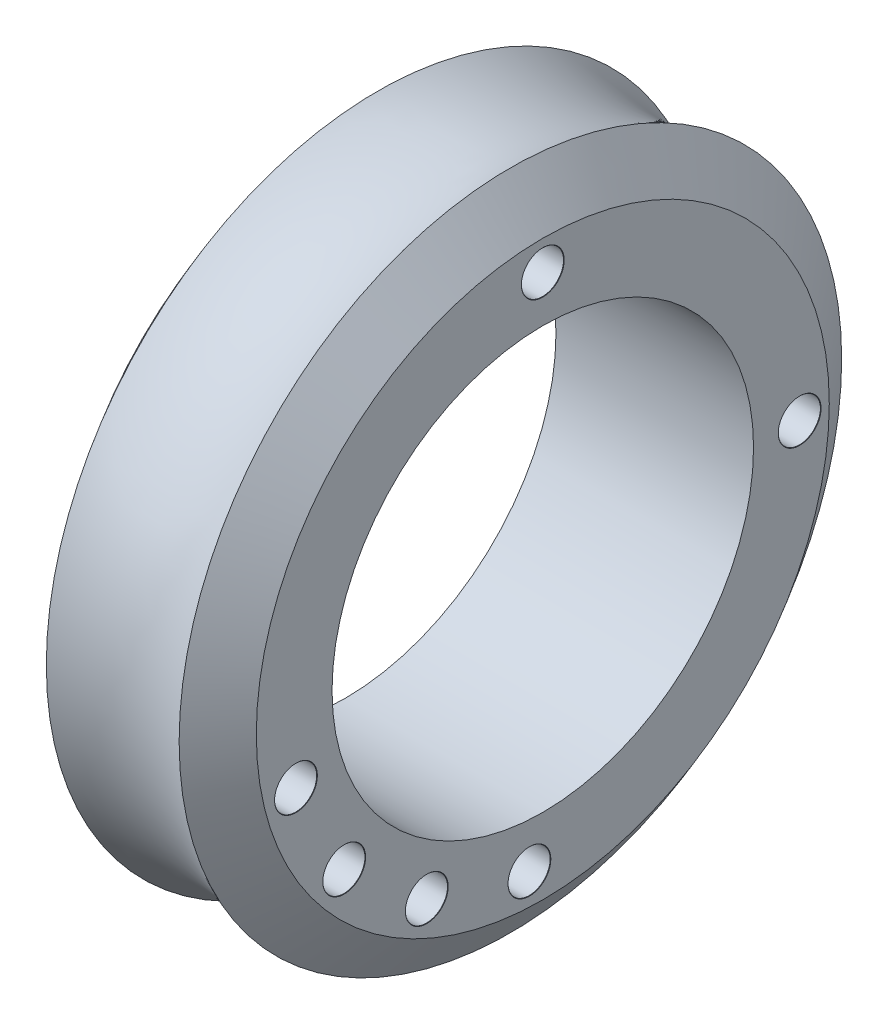
ISO-10303-21;
HEADER;
FILE_DESCRIPTION(('STEP AP214'),'2;1');
FILE_NAME('part.step','',(''),(''),'','','');
FILE_SCHEMA(('AUTOMOTIVE_DESIGN { 1 0 10303 214 1 1 1 1 }'));
ENDSEC;
DATA;
#1=APPLICATION_CONTEXT('core data for automotive mechanical design processes');
#2=APPLICATION_PROTOCOL_DEFINITION('international standard','automotive_design',2000,#1);
#3=PRODUCT_CONTEXT('',#1,'mechanical');
#4=PRODUCT('Part','Part','',(#3));
#5=PRODUCT_RELATED_PRODUCT_CATEGORY('part','',(#4));
#6=PRODUCT_DEFINITION_FORMATION('','',#4);
#7=PRODUCT_DEFINITION_CONTEXT('part definition',#1,'design');
#8=PRODUCT_DEFINITION('design','',#6,#7);
#9=PRODUCT_DEFINITION_SHAPE('','',#8);
#10=(LENGTH_UNIT() NAMED_UNIT(*) SI_UNIT(.MILLI.,.METRE.));
#11=(NAMED_UNIT(*) PLANE_ANGLE_UNIT() SI_UNIT($,.RADIAN.));
#12=(NAMED_UNIT(*) SI_UNIT($,.STERADIAN.) SOLID_ANGLE_UNIT());
#13=UNCERTAINTY_MEASURE_WITH_UNIT(LENGTH_MEASURE(1.E-05),#10,'distance_accuracy_value','');
#14=(GEOMETRIC_REPRESENTATION_CONTEXT(3) GLOBAL_UNCERTAINTY_ASSIGNED_CONTEXT((#13)) GLOBAL_UNIT_ASSIGNED_CONTEXT((#10,
#11,#12)) REPRESENTATION_CONTEXT('',''));
#15=CARTESIAN_POINT('',(0.,0.,0.));
#16=DIRECTION('',(0.,0.,1.));
#17=DIRECTION('',(1.,0.,0.));
#18=AXIS2_PLACEMENT_3D('',#15,#16,#17);
#19=CARTESIAN_POINT('',(0.,0.,0.));
#20=DIRECTION('',(1.,0.,0.));
#21=DIRECTION('',(0.,0.,-1.));
#22=AXIS2_PLACEMENT_3D('',#19,#20,#21);
#23=PLANE('',#22);
#24=CARTESIAN_POINT('',(0.,19.5000000000025,-4.69699592558647E-12));
#25=DIRECTION('',(1.,0.,0.));
#26=DIRECTION('',(0.,0.,-1.));
#27=AXIS2_PLACEMENT_3D('',#24,#25,#26);
#28=CIRCLE('',#27,1.6);
#29=CARTESIAN_POINT('',(0.,19.5000000000025,-1.60000000000469));
#30=VERTEX_POINT('',#29);
#31=EDGE_CURVE('E126',#30,#30,#28,.T.);
#32=ORIENTED_EDGE('',*,*,#31,.T.);
#33=EDGE_LOOP('',(#32));
#34=FACE_BOUND('',#33,.T.);
#35=CARTESIAN_POINT('',(0.,2.60478862967211E-12,-19.5000000000048));
#36=DIRECTION('',(1.,0.,0.));
#37=DIRECTION('',(0.,0.,-1.));
#38=AXIS2_PLACEMENT_3D('',#35,#36,#37);
#39=CIRCLE('',#38,1.6);
#40=CARTESIAN_POINT('',(0.,2.60478862967211E-12,-21.1000000000048));
#41=VERTEX_POINT('',#40);
#42=EDGE_CURVE('E117',#41,#41,#39,.T.);
#43=ORIENTED_EDGE('',*,*,#42,.T.);
#44=EDGE_LOOP('',(#43));
#45=FACE_BOUND('',#44,.T.);
#46=CARTESIAN_POINT('',(0.,-19.3734129742363,1.01531755110808));
#47=DIRECTION('',(1.,0.,0.));
#48=DIRECTION('',(0.,0.,-1.));
#49=AXIS2_PLACEMENT_3D('',#46,#47,#48);
#50=CIRCLE('',#49,1.6);
#51=CARTESIAN_POINT('',(0.,-19.3734129742363,-0.584682448891921));
#52=VERTEX_POINT('',#51);
#53=EDGE_CURVE('E106',#52,#52,#50,.T.);
#54=ORIENTED_EDGE('',*,*,#53,.T.);
#55=EDGE_LOOP('',(#54));
#56=FACE_BOUND('',#55,.T.);
#57=CARTESIAN_POINT('',(0.,-17.2855265692519,8.80741569494221));
#58=DIRECTION('',(1.,0.,0.));
#59=DIRECTION('',(0.,0.,-1.));
#60=AXIS2_PLACEMENT_3D('',#57,#58,#59);
#61=CIRCLE('',#60,1.6);
#62=CARTESIAN_POINT('',(0.,-17.2855265692519,7.20741569494221));
#63=VERTEX_POINT('',#62);
#64=EDGE_CURVE('E96',#63,#63,#61,.T.);
#65=ORIENTED_EDGE('',*,*,#64,.T.);
#66=EDGE_LOOP('',(#65));
#67=FACE_BOUND('',#66,.T.);
#68=CARTESIAN_POINT('',(0.,-5.02108947498657,18.738961030003));
#69=DIRECTION('',(1.,0.,0.));
#70=DIRECTION('',(0.,0.,-1.));
#71=AXIS2_PLACEMENT_3D('',#68,#69,#70);
#72=CIRCLE('',#71,1.6);
#73=CARTESIAN_POINT('',(0.,-5.02108947498657,17.138961030003));
#74=VERTEX_POINT('',#73);
#75=EDGE_CURVE('E86',#74,#74,#72,.T.);
#76=ORIENTED_EDGE('',*,*,#75,.T.);
#77=EDGE_LOOP('',(#76));
#78=FACE_BOUND('',#77,.T.);
#79=CARTESIAN_POINT('',(0.,-12.2088155863645,15.0766316522603));
#80=DIRECTION('',(1.,0.,0.));
#81=DIRECTION('',(0.,0.,-1.));
#82=AXIS2_PLACEMENT_3D('',#79,#80,#81);
#83=CIRCLE('',#82,1.6);
#84=CARTESIAN_POINT('',(0.,-12.2088155863645,13.4766316522603));
#85=VERTEX_POINT('',#84);
#86=EDGE_CURVE('E77',#85,#85,#83,.T.);
#87=ORIENTED_EDGE('',*,*,#86,.T.);
#88=EDGE_LOOP('',(#87));
#89=FACE_BOUND('',#88,.T.);
#90=CARTESIAN_POINT('',(0.,0.,0.));
#91=DIRECTION('',(1.,0.,0.));
#92=DIRECTION('',(0.,0.,-1.));
#93=AXIS2_PLACEMENT_3D('',#90,#91,#92);
#94=CIRCLE('',#93,16.);
#95=CARTESIAN_POINT('',(0.,0.,-16.));
#96=VERTEX_POINT('',#95);
#97=EDGE_CURVE('E73',#96,#96,#94,.T.);
#98=ORIENTED_EDGE('',*,*,#97,.T.);
#99=EDGE_LOOP('',(#98));
#100=FACE_BOUND('',#99,.T.);
#101=CARTESIAN_POINT('',(0.,0.,0.));
#102=DIRECTION('',(1.,0.,0.));
#103=DIRECTION('',(0.,0.,-1.));
#104=AXIS2_PLACEMENT_3D('',#101,#102,#103);
#105=CIRCLE('',#104,21.75);
#106=CARTESIAN_POINT('',(0.,0.,-21.75));
#107=VERTEX_POINT('',#106);
#108=EDGE_CURVE('E69',#107,#107,#105,.T.);
#109=ORIENTED_EDGE('',*,*,#108,.F.);
#110=EDGE_LOOP('',(#109));
#111=FACE_BOUND('',#110,.T.);
#112=ADVANCED_FACE('F47',(#34,#45,#56,#67,#78,#89,#100,#111),#23,.F.);
#113=CARTESIAN_POINT('',(0.,0.,0.));
#114=DIRECTION('',(1.,0.,0.));
#115=DIRECTION('',(0.,0.,-1.));
#116=AXIS2_PLACEMENT_3D('',#113,#114,#115);
#117=CONICAL_SURFACE('',#116,21.75,0.944709387251075);
#118=CARTESIAN_POINT('',(2.458670810193,0.,0.));
#119=DIRECTION('',(1.,0.,0.));
#120=DIRECTION('',(0.,0.,-1.));
#121=AXIS2_PLACEMENT_3D('',#118,#119,#120);
#122=CIRCLE('',#121,25.15);
#123=CARTESIAN_POINT('',(2.458670810193,0.,-25.15));
#124=VERTEX_POINT('',#123);
#125=EDGE_CURVE('E63',#124,#124,#122,.T.);
#126=ORIENTED_EDGE('',*,*,#125,.F.);
#127=EDGE_LOOP('',(#126));
#128=FACE_BOUND('',#127,.T.);
#129=ORIENTED_EDGE('',*,*,#108,.T.);
#130=EDGE_LOOP('',(#129));
#131=FACE_BOUND('',#130,.T.);
#132=ADVANCED_FACE('F171',(#128,#131),#117,.T.);
#133=CARTESIAN_POINT('',(7.5,0.,0.));
#134=DIRECTION('',(1.,0.,0.));
#135=DIRECTION('',(0.,0.,-1.));
#136=AXIS2_PLACEMENT_3D('',#133,#134,#135);
#137=TOROIDAL_SURFACE('',#136,35.625,11.625);
#138=CARTESIAN_POINT('',(12.541329189807,0.,0.));
#139=DIRECTION('',(1.,0.,0.));
#140=DIRECTION('',(0.,0.,-1.));
#141=AXIS2_PLACEMENT_3D('',#138,#139,#140);
#142=CIRCLE('',#141,25.15);
#143=CARTESIAN_POINT('',(12.541329189807,0.,-25.15));
#144=VERTEX_POINT('',#143);
#145=EDGE_CURVE('E56',#144,#144,#142,.T.);
#146=ORIENTED_EDGE('',*,*,#145,.F.);
#147=EDGE_LOOP('',(#146));
#148=FACE_BOUND('',#147,.T.);
#149=ORIENTED_EDGE('',*,*,#125,.T.);
#150=EDGE_LOOP('',(#149));
#151=FACE_BOUND('',#150,.T.);
#152=ADVANCED_FACE('F176',(#148,#151),#137,.F.);
#153=CARTESIAN_POINT('',(12.541329189807,0.,0.));
#154=DIRECTION('',(-1.,0.,0.));
#155=DIRECTION('',(0.,0.,1.));
#156=AXIS2_PLACEMENT_3D('',#153,#154,#155);
#157=CONICAL_SURFACE('',#156,25.15,0.944709387251075);
#158=CARTESIAN_POINT('',(15.,0.,0.));
#159=DIRECTION('',(1.,0.,0.));
#160=DIRECTION('',(0.,0.,-1.));
#161=AXIS2_PLACEMENT_3D('',#158,#159,#160);
#162=CIRCLE('',#161,21.75);
#163=CARTESIAN_POINT('',(15.,0.,-21.75));
#164=VERTEX_POINT('',#163);
#165=EDGE_CURVE('E10',#164,#164,#162,.T.);
#166=ORIENTED_EDGE('',*,*,#165,.F.);
#167=EDGE_LOOP('',(#166));
#168=FACE_BOUND('',#167,.T.);
#169=ORIENTED_EDGE('',*,*,#145,.T.);
#170=EDGE_LOOP('',(#169));
#171=FACE_BOUND('',#170,.T.);
#172=ADVANCED_FACE('F143',(#168,#171),#157,.T.);
#173=CARTESIAN_POINT('',(15.,21.75,0.));
#174=DIRECTION('',(-1.,0.,0.));
#175=DIRECTION('',(0.,0.,1.));
#176=AXIS2_PLACEMENT_3D('',#173,#174,#175);
#177=PLANE('',#176);
#178=CARTESIAN_POINT('',(15.,19.5000000000025,-4.69699592558647E-12));
#179=DIRECTION('',(1.,0.,0.));
#180=DIRECTION('',(0.,0.,-1.));
#181=AXIS2_PLACEMENT_3D('',#178,#179,#180);
#182=CIRCLE('',#181,1.625);
#183=CARTESIAN_POINT('',(15.,19.5000000000025,-1.6250000000047));
#184=VERTEX_POINT('',#183);
#185=EDGE_CURVE('E134',#184,#184,#182,.T.);
#186=ORIENTED_EDGE('',*,*,#185,.F.);
#187=EDGE_LOOP('',(#186));
#188=FACE_BOUND('',#187,.T.);
#189=CARTESIAN_POINT('',(15.,2.60478862967211E-12,-19.5000000000048));
#190=DIRECTION('',(1.,0.,0.));
#191=DIRECTION('',(0.,0.,-1.));
#192=AXIS2_PLACEMENT_3D('',#189,#190,#191);
#193=CIRCLE('',#192,1.625);
#194=CARTESIAN_POINT('',(15.,2.60478862967211E-12,-21.1250000000048));
#195=VERTEX_POINT('',#194);
#196=EDGE_CURVE('E123',#195,#195,#193,.T.);
#197=ORIENTED_EDGE('',*,*,#196,.F.);
#198=EDGE_LOOP('',(#197));
#199=FACE_BOUND('',#198,.T.);
#200=CARTESIAN_POINT('',(15.,-19.3734129742363,1.01531755110808));
#201=DIRECTION('',(1.,0.,0.));
#202=DIRECTION('',(0.,0.,-1.));
#203=AXIS2_PLACEMENT_3D('',#200,#201,#202);
#204=CIRCLE('',#203,1.625);
#205=CARTESIAN_POINT('',(15.,-19.3734129742363,-0.609682448891925));
#206=VERTEX_POINT('',#205);
#207=EDGE_CURVE('E113',#206,#206,#204,.T.);
#208=ORIENTED_EDGE('',*,*,#207,.F.);
#209=EDGE_LOOP('',(#208));
#210=FACE_BOUND('',#209,.T.);
#211=CARTESIAN_POINT('',(15.,-17.2855265692519,8.80741569494221));
#212=DIRECTION('',(1.,0.,0.));
#213=DIRECTION('',(0.,0.,-1.));
#214=AXIS2_PLACEMENT_3D('',#211,#212,#213);
#215=CIRCLE('',#214,1.625);
#216=CARTESIAN_POINT('',(15.,-17.2855265692519,7.18241569494221));
#217=VERTEX_POINT('',#216);
#218=EDGE_CURVE('E103',#217,#217,#215,.T.);
#219=ORIENTED_EDGE('',*,*,#218,.F.);
#220=EDGE_LOOP('',(#219));
#221=FACE_BOUND('',#220,.T.);
#222=CARTESIAN_POINT('',(15.,-5.02108947498657,18.738961030003));
#223=DIRECTION('',(1.,0.,0.));
#224=DIRECTION('',(0.,0.,-1.));
#225=AXIS2_PLACEMENT_3D('',#222,#223,#224);
#226=CIRCLE('',#225,1.625);
#227=CARTESIAN_POINT('',(15.,-5.02108947498657,17.113961030003));
#228=VERTEX_POINT('',#227);
#229=EDGE_CURVE('E93',#228,#228,#226,.T.);
#230=ORIENTED_EDGE('',*,*,#229,.F.);
#231=EDGE_LOOP('',(#230));
#232=FACE_BOUND('',#231,.T.);
#233=CARTESIAN_POINT('',(15.,-12.2088155863645,15.0766316522603));
#234=DIRECTION('',(1.,0.,0.));
#235=DIRECTION('',(0.,0.,-1.));
#236=AXIS2_PLACEMENT_3D('',#233,#234,#235);
#237=CIRCLE('',#236,1.625);
#238=CARTESIAN_POINT('',(15.,-12.2088155863645,13.4516316522603));
#239=VERTEX_POINT('',#238);
#240=EDGE_CURVE('E83',#239,#239,#237,.T.);
#241=ORIENTED_EDGE('',*,*,#240,.F.);
#242=EDGE_LOOP('',(#241));
#243=FACE_BOUND('',#242,.T.);
#244=CARTESIAN_POINT('',(15.,0.,0.));
#245=DIRECTION('',(-1.,0.,0.));
#246=DIRECTION('',(0.,0.,1.));
#247=AXIS2_PLACEMENT_3D('',#244,#245,#246);
#248=CIRCLE('',#247,16.);
#249=CARTESIAN_POINT('',(15.,0.,16.));
#250=VERTEX_POINT('',#249);
#251=EDGE_CURVE('E51',#250,#250,#248,.T.);
#252=ORIENTED_EDGE('',*,*,#251,.T.);
#253=EDGE_LOOP('',(#252));
#254=FACE_BOUND('',#253,.T.);
#255=ORIENTED_EDGE('',*,*,#165,.T.);
#256=EDGE_LOOP('',(#255));
#257=FACE_BOUND('',#256,.T.);
#258=ADVANCED_FACE('F49',(#188,#199,#210,#221,#232,#243,#254,#257),#177,.F.);
#259=CARTESIAN_POINT('',(0.,0.,0.));
#260=DIRECTION('',(1.,0.,0.));
#261=DIRECTION('',(0.,0.,-1.));
#262=AXIS2_PLACEMENT_3D('',#259,#260,#261);
#263=CYLINDRICAL_SURFACE('',#262,16.);
#264=ORIENTED_EDGE('',*,*,#97,.F.);
#265=EDGE_LOOP('',(#264));
#266=FACE_BOUND('',#265,.T.);
#267=ORIENTED_EDGE('',*,*,#251,.F.);
#268=EDGE_LOOP('',(#267));
#269=FACE_BOUND('',#268,.T.);
#270=ADVANCED_FACE('F142',(#266,#269),#263,.F.);
#271=CARTESIAN_POINT('',(15.,-12.2088155863645,15.0766316522603));
#272=DIRECTION('',(1.,0.,0.));
#273=DIRECTION('',(0.,0.,-1.));
#274=AXIS2_PLACEMENT_3D('',#271,#272,#273);
#275=CYLINDRICAL_SURFACE('',#274,1.6);
#276=ORIENTED_EDGE('',*,*,#86,.F.);
#277=EDGE_LOOP('',(#276));
#278=FACE_BOUND('',#277,.T.);
#279=CARTESIAN_POINT('',(14.975,-12.2088155863645,15.0766316522603));
#280=DIRECTION('',(1.,0.,0.));
#281=DIRECTION('',(0.,0.,-1.));
#282=AXIS2_PLACEMENT_3D('',#279,#280,#281);
#283=CIRCLE('',#282,1.6);
#284=CARTESIAN_POINT('',(14.975,-12.2088155863645,13.4766316522603));
#285=VERTEX_POINT('',#284);
#286=EDGE_CURVE('E80',#285,#285,#283,.T.);
#287=ORIENTED_EDGE('',*,*,#286,.T.);
#288=EDGE_LOOP('',(#287));
#289=FACE_BOUND('',#288,.T.);
#290=ADVANCED_FACE('F159',(#278,#289),#275,.F.);
#291=CARTESIAN_POINT('',(15.,-12.2088155863645,15.0766316522603));
#292=DIRECTION('',(1.,0.,0.));
#293=DIRECTION('',(0.,0.,-1.));
#294=AXIS2_PLACEMENT_3D('',#291,#292,#293);
#295=CONICAL_SURFACE('',#294,1.625,0.785398163397414);
#296=ORIENTED_EDGE('',*,*,#286,.F.);
#297=EDGE_LOOP('',(#296));
#298=FACE_BOUND('',#297,.T.);
#299=ORIENTED_EDGE('',*,*,#240,.T.);
#300=EDGE_LOOP('',(#299));
#301=FACE_BOUND('',#300,.T.);
#302=ADVANCED_FACE('F165',(#298,#301),#295,.F.);
#303=CARTESIAN_POINT('',(15.,-5.02108947498657,18.738961030003));
#304=DIRECTION('',(1.,0.,0.));
#305=DIRECTION('',(0.,0.,-1.));
#306=AXIS2_PLACEMENT_3D('',#303,#304,#305);
#307=CYLINDRICAL_SURFACE('',#306,1.6);
#308=ORIENTED_EDGE('',*,*,#75,.F.);
#309=EDGE_LOOP('',(#308));
#310=FACE_BOUND('',#309,.T.);
#311=CARTESIAN_POINT('',(14.975,-5.02108947498657,18.738961030003));
#312=DIRECTION('',(1.,0.,0.));
#313=DIRECTION('',(0.,0.,-1.));
#314=AXIS2_PLACEMENT_3D('',#311,#312,#313);
#315=CIRCLE('',#314,1.6);
#316=CARTESIAN_POINT('',(14.975,-5.02108947498657,17.138961030003));
#317=VERTEX_POINT('',#316);
#318=EDGE_CURVE('E90',#317,#317,#315,.T.);
#319=ORIENTED_EDGE('',*,*,#318,.T.);
#320=EDGE_LOOP('',(#319));
#321=FACE_BOUND('',#320,.T.);
#322=ADVANCED_FACE('F277',(#310,#321),#307,.F.);
#323=CARTESIAN_POINT('',(15.,-5.02108947498657,18.738961030003));
#324=DIRECTION('',(1.,0.,0.));
#325=DIRECTION('',(0.,0.,-1.));
#326=AXIS2_PLACEMENT_3D('',#323,#324,#325);
#327=CONICAL_SURFACE('',#326,1.625,0.785398163397414);
#328=ORIENTED_EDGE('',*,*,#318,.F.);
#329=EDGE_LOOP('',(#328));
#330=FACE_BOUND('',#329,.T.);
#331=ORIENTED_EDGE('',*,*,#229,.T.);
#332=EDGE_LOOP('',(#331));
#333=FACE_BOUND('',#332,.T.);
#334=ADVANCED_FACE('F268',(#330,#333),#327,.F.);
#335=CARTESIAN_POINT('',(15.,-17.2855265692519,8.80741569494221));
#336=DIRECTION('',(1.,0.,0.));
#337=DIRECTION('',(0.,0.,-1.));
#338=AXIS2_PLACEMENT_3D('',#335,#336,#337);
#339=CYLINDRICAL_SURFACE('',#338,1.6);
#340=ORIENTED_EDGE('',*,*,#64,.F.);
#341=EDGE_LOOP('',(#340));
#342=FACE_BOUND('',#341,.T.);
#343=CARTESIAN_POINT('',(14.975,-17.2855265692519,8.80741569494221));
#344=DIRECTION('',(1.,0.,0.));
#345=DIRECTION('',(0.,0.,-1.));
#346=AXIS2_PLACEMENT_3D('',#343,#344,#345);
#347=CIRCLE('',#346,1.6);
#348=CARTESIAN_POINT('',(14.975,-17.2855265692519,7.20741569494221));
#349=VERTEX_POINT('',#348);
#350=EDGE_CURVE('E100',#349,#349,#347,.T.);
#351=ORIENTED_EDGE('',*,*,#350,.T.);
#352=EDGE_LOOP('',(#351));
#353=FACE_BOUND('',#352,.T.);
#354=ADVANCED_FACE('F259',(#342,#353),#339,.F.);
#355=CARTESIAN_POINT('',(15.,-17.2855265692519,8.80741569494221));
#356=DIRECTION('',(1.,0.,0.));
#357=DIRECTION('',(0.,0.,-1.));
#358=AXIS2_PLACEMENT_3D('',#355,#356,#357);
#359=CONICAL_SURFACE('',#358,1.625,0.785398163397414);
#360=ORIENTED_EDGE('',*,*,#350,.F.);
#361=EDGE_LOOP('',(#360));
#362=FACE_BOUND('',#361,.T.);
#363=ORIENTED_EDGE('',*,*,#218,.T.);
#364=EDGE_LOOP('',(#363));
#365=FACE_BOUND('',#364,.T.);
#366=ADVANCED_FACE('F249',(#362,#365),#359,.F.);
#367=CARTESIAN_POINT('',(15.,-19.3734129742363,1.01531755110808));
#368=DIRECTION('',(1.,0.,0.));
#369=DIRECTION('',(0.,0.,-1.));
#370=AXIS2_PLACEMENT_3D('',#367,#368,#369);
#371=CYLINDRICAL_SURFACE('',#370,1.6);
#372=ORIENTED_EDGE('',*,*,#53,.F.);
#373=EDGE_LOOP('',(#372));
#374=FACE_BOUND('',#373,.T.);
#375=CARTESIAN_POINT('',(14.975,-19.3734129742363,1.01531755110808));
#376=DIRECTION('',(1.,0.,0.));
#377=DIRECTION('',(0.,0.,-1.));
#378=AXIS2_PLACEMENT_3D('',#375,#376,#377);
#379=CIRCLE('',#378,1.6);
#380=CARTESIAN_POINT('',(14.975,-19.3734129742363,-0.584682448891924));
#381=VERTEX_POINT('',#380);
#382=EDGE_CURVE('E109',#381,#381,#379,.T.);
#383=ORIENTED_EDGE('',*,*,#382,.T.);
#384=EDGE_LOOP('',(#383));
#385=FACE_BOUND('',#384,.T.);
#386=ADVANCED_FACE('F240',(#374,#385),#371,.F.);
#387=CARTESIAN_POINT('',(15.,-19.3734129742363,1.01531755110808));
#388=DIRECTION('',(1.,0.,0.));
#389=DIRECTION('',(0.,0.,-1.));
#390=AXIS2_PLACEMENT_3D('',#387,#388,#389);
#391=CONICAL_SURFACE('',#390,1.625,0.785398163397414);
#392=ORIENTED_EDGE('',*,*,#382,.F.);
#393=EDGE_LOOP('',(#392));
#394=FACE_BOUND('',#393,.T.);
#395=ORIENTED_EDGE('',*,*,#207,.T.);
#396=EDGE_LOOP('',(#395));
#397=FACE_BOUND('',#396,.T.);
#398=ADVANCED_FACE('F231',(#394,#397),#391,.F.);
#399=CARTESIAN_POINT('',(15.,2.60478862967211E-12,-19.5000000000048));
#400=DIRECTION('',(1.,0.,0.));
#401=DIRECTION('',(0.,0.,-1.));
#402=AXIS2_PLACEMENT_3D('',#399,#400,#401);
#403=CYLINDRICAL_SURFACE('',#402,1.6);
#404=ORIENTED_EDGE('',*,*,#42,.F.);
#405=EDGE_LOOP('',(#404));
#406=FACE_BOUND('',#405,.T.);
#407=CARTESIAN_POINT('',(14.975,2.60478862967211E-12,-19.5000000000048));
#408=DIRECTION('',(1.,0.,0.));
#409=DIRECTION('',(0.,0.,-1.));
#410=AXIS2_PLACEMENT_3D('',#407,#408,#409);
#411=CIRCLE('',#410,1.6);
#412=CARTESIAN_POINT('',(14.975,2.60478862967211E-12,-21.1000000000048));
#413=VERTEX_POINT('',#412);
#414=EDGE_CURVE('E120',#413,#413,#411,.T.);
#415=ORIENTED_EDGE('',*,*,#414,.T.);
#416=EDGE_LOOP('',(#415));
#417=FACE_BOUND('',#416,.T.);
#418=ADVANCED_FACE('F223',(#406,#417),#403,.F.);
#419=CARTESIAN_POINT('',(15.,2.60478862967211E-12,-19.5000000000048));
#420=DIRECTION('',(1.,0.,0.));
#421=DIRECTION('',(0.,0.,-1.));
#422=AXIS2_PLACEMENT_3D('',#419,#420,#421);
#423=CONICAL_SURFACE('',#422,1.625,0.785398163397409);
#424=ORIENTED_EDGE('',*,*,#414,.F.);
#425=EDGE_LOOP('',(#424));
#426=FACE_BOUND('',#425,.T.);
#427=ORIENTED_EDGE('',*,*,#196,.T.);
#428=EDGE_LOOP('',(#427));
#429=FACE_BOUND('',#428,.T.);
#430=ADVANCED_FACE('F198',(#426,#429),#423,.F.);
#431=CARTESIAN_POINT('',(15.,19.5000000000025,-4.69699592558647E-12));
#432=DIRECTION('',(1.,0.,0.));
#433=DIRECTION('',(0.,0.,-1.));
#434=AXIS2_PLACEMENT_3D('',#431,#432,#433);
#435=CYLINDRICAL_SURFACE('',#434,1.6);
#436=ORIENTED_EDGE('',*,*,#31,.F.);
#437=EDGE_LOOP('',(#436));
#438=FACE_BOUND('',#437,.T.);
#439=CARTESIAN_POINT('',(14.975,19.5000000000025,-4.69699592558647E-12));
#440=DIRECTION('',(1.,0.,0.));
#441=DIRECTION('',(0.,0.,-1.));
#442=AXIS2_PLACEMENT_3D('',#439,#440,#441);
#443=CIRCLE('',#442,1.6);
#444=CARTESIAN_POINT('',(14.975,19.5000000000025,-1.6000000000047));
#445=VERTEX_POINT('',#444);
#446=EDGE_CURVE('E130',#445,#445,#443,.T.);
#447=ORIENTED_EDGE('',*,*,#446,.T.);
#448=EDGE_LOOP('',(#447));
#449=FACE_BOUND('',#448,.T.);
#450=ADVANCED_FACE('F196',(#438,#449),#435,.F.);
#451=CARTESIAN_POINT('',(15.,19.5000000000025,-4.69699592558647E-12));
#452=DIRECTION('',(1.,0.,0.));
#453=DIRECTION('',(0.,0.,-1.));
#454=AXIS2_PLACEMENT_3D('',#451,#452,#453);
#455=CONICAL_SURFACE('',#454,1.625,0.785398163397414);
#456=ORIENTED_EDGE('',*,*,#446,.F.);
#457=EDGE_LOOP('',(#456));
#458=FACE_BOUND('',#457,.T.);
#459=ORIENTED_EDGE('',*,*,#185,.T.);
#460=EDGE_LOOP('',(#459));
#461=FACE_BOUND('',#460,.T.);
#462=ADVANCED_FACE('F138',(#458,#461),#455,.F.);
#463=CLOSED_SHELL('',(#112,#132,#152,#172,#258,#270,#290,#302,#322,#334,#354,#366,#386,#398,
#418,#430,#450,#462));
#464=MANIFOLD_SOLID_BREP('B2',#463);
#465=ADVANCED_BREP_SHAPE_REPRESENTATION('',(#18,#464),#14);
#466=SHAPE_DEFINITION_REPRESENTATION(#9,#465);
ENDSEC;
END-ISO-10303-21;
